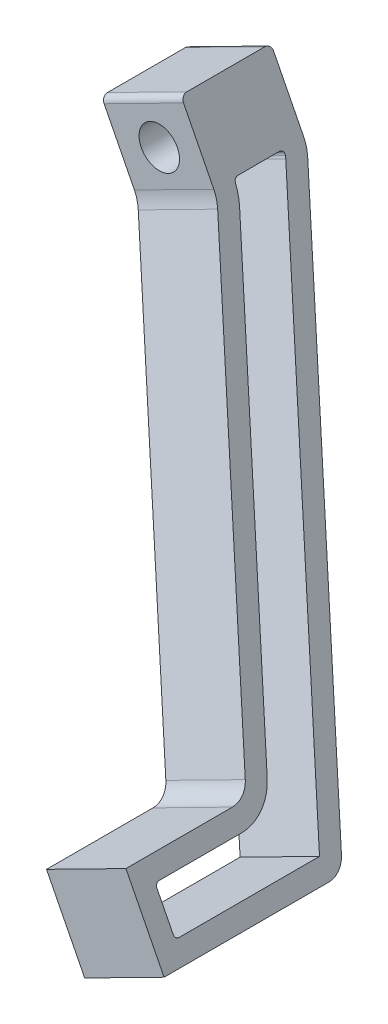
ISO-10303-21;
HEADER;
FILE_DESCRIPTION(('STEP AP214'),'2;1');
FILE_NAME('part.step','',(''),(''),'','','');
FILE_SCHEMA(('AUTOMOTIVE_DESIGN { 1 0 10303 214 1 1 1 1 }'));
ENDSEC;
DATA;
#1=APPLICATION_CONTEXT('core data for automotive mechanical design processes');
#2=APPLICATION_PROTOCOL_DEFINITION('international standard','automotive_design',2000,#1);
#3=PRODUCT_CONTEXT('',#1,'mechanical');
#4=PRODUCT('Part','Part','',(#3));
#5=PRODUCT_RELATED_PRODUCT_CATEGORY('part','',(#4));
#6=PRODUCT_DEFINITION_FORMATION('','',#4);
#7=PRODUCT_DEFINITION_CONTEXT('part definition',#1,'design');
#8=PRODUCT_DEFINITION('design','',#6,#7);
#9=PRODUCT_DEFINITION_SHAPE('','',#8);
#10=(LENGTH_UNIT() NAMED_UNIT(*) SI_UNIT(.MILLI.,.METRE.));
#11=(NAMED_UNIT(*) PLANE_ANGLE_UNIT() SI_UNIT($,.RADIAN.));
#12=(NAMED_UNIT(*) SI_UNIT($,.STERADIAN.) SOLID_ANGLE_UNIT());
#13=UNCERTAINTY_MEASURE_WITH_UNIT(LENGTH_MEASURE(1.E-05),#10,'distance_accuracy_value','');
#14=(GEOMETRIC_REPRESENTATION_CONTEXT(3) GLOBAL_UNCERTAINTY_ASSIGNED_CONTEXT((#13)) GLOBAL_UNIT_ASSIGNED_CONTEXT((#10,
#11,#12)) REPRESENTATION_CONTEXT('',''));
#15=CARTESIAN_POINT('',(0.,0.,0.));
#16=DIRECTION('',(0.,0.,1.));
#17=DIRECTION('',(1.,0.,0.));
#18=AXIS2_PLACEMENT_3D('',#15,#16,#17);
#19=CARTESIAN_POINT('',(632.18446511918,859.888360362767,1293.58737937312));
#20=DIRECTION('',(0.453212777096288,-0.89140236631763,0.));
#21=DIRECTION('',(0.89140236631763,0.453212777096288,0.));
#22=AXIS2_PLACEMENT_3D('',#19,#20,#21);
#23=PLANE('',#22);
#24=DIRECTION('',(0.,0.,1.));
#25=VECTOR('',#24,1.);
#26=CARTESIAN_POINT('',(632.18446511918,859.888360362767,1293.58737937312));
#27=LINE('',#26,#25);
#28=CARTESIAN_POINT('',(632.18446511918,859.888360362767,1267.03572984114));
#29=VERTEX_POINT('',#28);
#30=CARTESIAN_POINT('',(632.18446511918,859.888360362767,1293.58737937312));
#31=VERTEX_POINT('',#30);
#32=EDGE_CURVE('E261',#29,#31,#27,.T.);
#33=ORIENTED_EDGE('',*,*,#32,.F.);
#34=DIRECTION('',(-0.89140236631763,-0.453212777096288,0.));
#35=VECTOR('',#34,1.);
#36=CARTESIAN_POINT('',(612.37304752777,849.815706391802,1267.03572984114));
#37=LINE('',#36,#35);
#38=CARTESIAN_POINT('',(612.37304752777,849.815706391802,1267.03572984114));
#39=VERTEX_POINT('',#38);
#40=EDGE_CURVE('E337',#29,#39,#37,.T.);
#41=ORIENTED_EDGE('',*,*,#40,.T.);
#42=DIRECTION('',(0.,0.,1.));
#43=VECTOR('',#42,1.);
#44=CARTESIAN_POINT('',(612.37304752777,849.815706391802,1293.58737937312));
#45=LINE('',#44,#43);
#46=CARTESIAN_POINT('',(612.37304752777,849.815706391802,1293.58737937312));
#47=VERTEX_POINT('',#46);
#48=EDGE_CURVE('E260',#39,#47,#45,.T.);
#49=ORIENTED_EDGE('',*,*,#48,.T.);
#50=DIRECTION('',(-0.89140236631763,-0.453212777096288,0.));
#51=VECTOR('',#50,1.);
#52=CARTESIAN_POINT('',(632.18446511918,859.888360362767,1293.58737937312));
#53=LINE('',#52,#51);
#54=EDGE_CURVE('E303',#31,#47,#53,.T.);
#55=ORIENTED_EDGE('',*,*,#54,.F.);
#56=EDGE_LOOP('',(#33,#41,#49,#55));
#57=FACE_BOUND('',#56,.T.);
#58=ADVANCED_FACE('F43',(#57),#23,.F.);
#59=CARTESIAN_POINT('',(641.701933438202,841.168910670097,1293.58737937312));
#60=DIRECTION('',(0.,0.,-1.));
#61=DIRECTION('',(-1.,0.,0.));
#62=AXIS2_PLACEMENT_3D('',#59,#60,#61);
#63=PLANE('',#62);
#64=DIRECTION('',(0.453212777096286,-0.891402366317631,0.));
#65=VECTOR('',#64,1.);
#66=CARTESIAN_POINT('',(621.890515846792,831.096256699132,1293.58737937312));
#67=LINE('',#66,#65);
#68=CARTESIAN_POINT('',(621.890515846792,831.096256699132,1293.58737937312));
#69=VERTEX_POINT('',#68);
#70=EDGE_CURVE('E284',#47,#69,#67,.T.);
#71=ORIENTED_EDGE('',*,*,#70,.T.);
#72=DIRECTION('',(-0.89140236631763,-0.453212777096288,0.));
#73=VECTOR('',#72,1.);
#74=CARTESIAN_POINT('',(641.701933438202,841.168910670097,1293.58737937312));
#75=LINE('',#74,#73);
#76=CARTESIAN_POINT('',(641.701933438202,841.168910670097,1293.58737937312));
#77=VERTEX_POINT('',#76);
#78=EDGE_CURVE('E282',#77,#69,#75,.T.);
#79=ORIENTED_EDGE('',*,*,#78,.F.);
#80=DIRECTION('',(0.453212777096286,-0.891402366317631,0.));
#81=VECTOR('',#80,1.);
#82=CARTESIAN_POINT('',(641.701933438202,841.168910670097,1293.58737937312));
#83=LINE('',#82,#81);
#84=EDGE_CURVE('E263',#31,#77,#83,.T.);
#85=ORIENTED_EDGE('',*,*,#84,.F.);
#86=ORIENTED_EDGE('',*,*,#54,.T.);
#87=EDGE_LOOP('',(#71,#79,#85,#86));
#88=FACE_BOUND('',#87,.T.);
#89=ADVANCED_FACE('F414',(#88),#63,.F.);
#90=CARTESIAN_POINT('',(641.701933438202,841.168910670097,1293.58737937312));
#91=DIRECTION('',(-0.453212777096288,0.89140236631763,0.));
#92=DIRECTION('',(-0.89140236631763,-0.453212777096288,0.));
#93=AXIS2_PLACEMENT_3D('',#90,#91,#92);
#94=PLANE('',#93);
#95=DIRECTION('',(0.,0.,-1.));
#96=VECTOR('',#95,1.);
#97=CARTESIAN_POINT('',(621.890515846792,831.096256699132,1293.58737937312));
#98=LINE('',#97,#96);
#99=CARTESIAN_POINT('',(621.890515846792,831.096256699132,1252.55265787544));
#100=VERTEX_POINT('',#99);
#101=EDGE_CURVE('E286',#69,#100,#98,.T.);
#102=ORIENTED_EDGE('',*,*,#101,.T.);
#103=DIRECTION('',(-0.89140236631763,-0.453212777096288,0.));
#104=VECTOR('',#103,1.);
#105=CARTESIAN_POINT('',(641.701933438202,841.168910670097,1252.55265787544));
#106=LINE('',#105,#104);
#107=CARTESIAN_POINT('',(641.701933438202,841.168910670097,1252.55265787544));
#108=VERTEX_POINT('',#107);
#109=EDGE_CURVE('E333',#100,#108,#106,.F.);
#110=ORIENTED_EDGE('',*,*,#109,.T.);
#111=DIRECTION('',(0.,0.,-1.));
#112=VECTOR('',#111,1.);
#113=CARTESIAN_POINT('',(641.701933438202,841.168910670097,1293.58737937312));
#114=LINE('',#113,#112);
#115=EDGE_CURVE('E266',#77,#108,#114,.T.);
#116=ORIENTED_EDGE('',*,*,#115,.F.);
#117=ORIENTED_EDGE('',*,*,#78,.T.);
#118=EDGE_LOOP('',(#102,#110,#116,#117));
#119=FACE_BOUND('',#118,.T.);
#120=ADVANCED_FACE('F422',(#119),#94,.F.);
#121=CARTESIAN_POINT('',(587.243580373247,948.280420409258,1203.42531493312));
#122=DIRECTION('',(-0.161044482403292,0.316750630060443,0.934737242782039));
#123=DIRECTION('',(0.,-0.947099592759699,0.320939809612974));
#124=AXIS2_PLACEMENT_3D('',#121,#122,#123);
#125=PLANE('',#124);
#126=DIRECTION('',(-0.423634861656575,0.833226990101127,-0.355339678274509));
#127=VECTOR('',#126,1.);
#128=CARTESIAN_POINT('',(587.243580373247,948.280420409258,1203.42531493312));
#129=LINE('',#128,#127);
#130=CARTESIAN_POINT('',(640.241091964737,844.042169351383,1247.87897166153));
#131=VERTEX_POINT('',#130);
#132=CARTESIAN_POINT('',(588.021640939397,946.750090584385,1204.0779425053));
#133=VERTEX_POINT('',#132);
#134=EDGE_CURVE('E269',#131,#133,#129,.T.);
#135=ORIENTED_EDGE('',*,*,#134,.F.);
#136=DIRECTION('',(-0.89140236631763,-0.453212777096288,0.));
#137=VECTOR('',#136,1.);
#138=CARTESIAN_POINT('',(640.241091964737,844.042169351383,1247.87897166153));
#139=LINE('',#138,#137);
#140=CARTESIAN_POINT('',(620.429674373327,833.969515380418,1247.87897166153));
#141=VERTEX_POINT('',#140);
#142=EDGE_CURVE('E328',#131,#141,#139,.T.);
#143=ORIENTED_EDGE('',*,*,#142,.T.);
#144=DIRECTION('',(-0.423634861656575,0.833226990101127,-0.355339678274509));
#145=VECTOR('',#144,1.);
#146=CARTESIAN_POINT('',(567.432162781838,938.207766438293,1203.42531493312));
#147=LINE('',#146,#145);
#148=CARTESIAN_POINT('',(568.210223347987,936.67743661342,1204.0779425053));
#149=VERTEX_POINT('',#148);
#150=EDGE_CURVE('E289',#141,#149,#147,.T.);
#151=ORIENTED_EDGE('',*,*,#150,.T.);
#152=DIRECTION('',(-0.89140236631763,-0.453212777096288,0.));
#153=VECTOR('',#152,1.);
#154=CARTESIAN_POINT('',(588.021640939397,946.750090584385,1204.0779425053));
#155=LINE('',#154,#153);
#156=EDGE_CURVE('E318',#149,#133,#155,.F.);
#157=ORIENTED_EDGE('',*,*,#156,.T.);
#158=EDGE_LOOP('',(#135,#143,#151,#157));
#159=FACE_BOUND('',#158,.T.);
#160=ADVANCED_FACE('F557',(#159),#125,.F.);
#161=CARTESIAN_POINT('',(578.179324831322,966.10846773561,1203.42531493312));
#162=DIRECTION('',(0.,0.,1.));
#163=DIRECTION('',(1.,0.,0.));
#164=AXIS2_PLACEMENT_3D('',#161,#162,#163);
#165=PLANE('',#164);
#166=CARTESIAN_POINT('',(572.80574380658,952.158117086952,1203.42531493312));
#167=DIRECTION('',(0.,0.,-1.));
#168=DIRECTION('',(-1.,0.,0.));
#169=AXIS2_PLACEMENT_3D('',#166,#167,#168);
#170=CIRCLE('',#169,5.04190000000004);
#171=CARTESIAN_POINT('',(567.76384380658,952.158117086952,1203.42531493312));
#172=VERTEX_POINT('',#171);
#173=EDGE_CURVE('E253',#172,#172,#170,.T.);
#174=ORIENTED_EDGE('',*,*,#173,.F.);
#175=EDGE_LOOP('',(#174));
#176=FACE_BOUND('',#175,.T.);
#177=DIRECTION('',(-0.45321277709629,0.891402366317629,0.));
#178=VECTOR('',#177,1.);
#179=CARTESIAN_POINT('',(558.367907239912,956.035813764645,1203.42531493312));
#180=LINE('',#179,#178);
#181=CARTESIAN_POINT('',(566.599778523954,939.844942914024,1203.42531493312));
#182=VERTEX_POINT('',#181);
#183=CARTESIAN_POINT('',(559.047726405557,954.698710215169,1203.42531493312));
#184=VERTEX_POINT('',#183);
#185=EDGE_CURVE('E291',#182,#184,#180,.T.);
#186=ORIENTED_EDGE('',*,*,#185,.T.);
#187=DIRECTION('',(-0.89140236631763,-0.453212777096288,0.));
#188=VECTOR('',#187,1.);
#189=CARTESIAN_POINT('',(578.859143996966,964.771364186134,1203.42531493312));
#190=LINE('',#189,#188);
#191=CARTESIAN_POINT('',(578.859143996966,964.771364186134,1203.42531493312));
#192=VERTEX_POINT('',#191);
#193=EDGE_CURVE('E355',#184,#192,#190,.F.);
#194=ORIENTED_EDGE('',*,*,#193,.T.);
#195=DIRECTION('',(-0.45321277709629,0.891402366317629,0.));
#196=VECTOR('',#195,1.);
#197=CARTESIAN_POINT('',(578.179324831322,966.10846773561,1203.42531493312));
#198=LINE('',#197,#196);
#199=CARTESIAN_POINT('',(586.411196115364,949.917596884989,1203.42531493312));
#200=VERTEX_POINT('',#199);
#201=EDGE_CURVE('E271',#200,#192,#198,.T.);
#202=ORIENTED_EDGE('',*,*,#201,.F.);
#203=DIRECTION('',(-0.89140236631763,-0.453212777096288,0.));
#204=VECTOR('',#203,1.);
#205=CARTESIAN_POINT('',(586.411196115364,949.917596884989,1203.42531493312));
#206=LINE('',#205,#204);
#207=EDGE_CURVE('E312',#200,#182,#206,.T.);
#208=ORIENTED_EDGE('',*,*,#207,.T.);
#209=EDGE_LOOP('',(#186,#194,#202,#208));
#210=FACE_BOUND('',#209,.T.);
#211=ADVANCED_FACE('F553',(#176,#210),#165,.F.);
#212=CARTESIAN_POINT('',(578.179324831322,966.10846773561,1203.42531493312));
#213=DIRECTION('',(0.453212777096288,-0.89140236631763,0.));
#214=DIRECTION('',(0.89140236631763,0.453212777096288,0.));
#215=AXIS2_PLACEMENT_3D('',#212,#213,#214);
#216=PLANE('',#215);
#217=DIRECTION('',(0.,0.,1.));
#218=VECTOR('',#217,1.);
#219=CARTESIAN_POINT('',(578.179324831322,966.10846773561,1203.42531493312));
#220=LINE('',#219,#218);
#221=CARTESIAN_POINT('',(578.179324831322,966.10846773561,1204.92531493312));
#222=VERTEX_POINT('',#221);
#223=CARTESIAN_POINT('',(578.179324831322,966.108467735611,1224.39152151915));
#224=VERTEX_POINT('',#223);
#225=EDGE_CURVE('E274',#222,#224,#220,.T.);
#226=ORIENTED_EDGE('',*,*,#225,.F.);
#227=DIRECTION('',(-0.89140236631763,-0.453212777096288,0.));
#228=VECTOR('',#227,1.);
#229=CARTESIAN_POINT('',(578.179324831322,966.10846773561,1204.92531493312));
#230=LINE('',#229,#228);
#231=CARTESIAN_POINT('',(558.367907239912,956.035813764645,1204.92531493312));
#232=VERTEX_POINT('',#231);
#233=EDGE_CURVE('E348',#222,#232,#230,.T.);
#234=ORIENTED_EDGE('',*,*,#233,.T.);
#235=DIRECTION('',(0.,0.,1.));
#236=VECTOR('',#235,1.);
#237=CARTESIAN_POINT('',(558.367907239912,956.035813764645,1203.42531493312));
#238=LINE('',#237,#236);
#239=CARTESIAN_POINT('',(558.367907239912,956.035813764646,1224.39152151915));
#240=VERTEX_POINT('',#239);
#241=EDGE_CURVE('E294',#232,#240,#238,.T.);
#242=ORIENTED_EDGE('',*,*,#241,.T.);
#243=DIRECTION('',(-0.89140236631763,-0.453212777096288,0.));
#244=VECTOR('',#243,1.);
#245=CARTESIAN_POINT('',(578.179324831321,966.108467735611,1224.39152151915));
#246=LINE('',#245,#244);
#247=EDGE_CURVE('E346',#240,#224,#246,.F.);
#248=ORIENTED_EDGE('',*,*,#247,.T.);
#249=EDGE_LOOP('',(#226,#234,#242,#248));
#250=FACE_BOUND('',#249,.T.);
#251=ADVANCED_FACE('F549',(#250),#216,.F.);
#252=CARTESIAN_POINT('',(578.179324831322,966.108467735611,1225.89152151915));
#253=DIRECTION('',(0.,0.,-1.));
#254=DIRECTION('',(-1.,0.,0.));
#255=AXIS2_PLACEMENT_3D('',#252,#253,#254);
#256=PLANE('',#255);
#257=CARTESIAN_POINT('',(572.80574380658,952.158117086952,1225.89152151915));
#258=DIRECTION('',(0.,0.,-1.));
#259=DIRECTION('',(-1.,0.,0.));
#260=AXIS2_PLACEMENT_3D('',#257,#258,#259);
#261=CIRCLE('',#260,5.04189999999999);
#262=CARTESIAN_POINT('',(567.76384380658,952.158117086952,1225.89152151915));
#263=VERTEX_POINT('',#262);
#264=EDGE_CURVE('E257',#263,#263,#261,.T.);
#265=ORIENTED_EDGE('',*,*,#264,.T.);
#266=EDGE_LOOP('',(#265));
#267=FACE_BOUND('',#266,.T.);
#268=DIRECTION('',(0.453212777096286,-0.891402366317631,0.));
#269=VECTOR('',#268,1.);
#270=CARTESIAN_POINT('',(578.179324831322,966.108467735611,1225.89152151915));
#271=LINE('',#270,#269);
#272=CARTESIAN_POINT('',(578.859143996966,964.771364186134,1225.89152151915));
#273=VERTEX_POINT('',#272);
#274=CARTESIAN_POINT('',(586.411196115364,949.917596884989,1225.89152151915));
#275=VERTEX_POINT('',#274);
#276=EDGE_CURVE('E277',#273,#275,#271,.T.);
#277=ORIENTED_EDGE('',*,*,#276,.F.);
#278=DIRECTION('',(-0.89140236631763,-0.453212777096288,0.));
#279=VECTOR('',#278,1.);
#280=CARTESIAN_POINT('',(578.859143996966,964.771364186134,1225.89152151915));
#281=LINE('',#280,#279);
#282=CARTESIAN_POINT('',(559.047726405557,954.698710215169,1225.89152151915));
#283=VERTEX_POINT('',#282);
#284=EDGE_CURVE('E361',#273,#283,#281,.T.);
#285=ORIENTED_EDGE('',*,*,#284,.T.);
#286=DIRECTION('',(0.453212777096286,-0.891402366317631,0.));
#287=VECTOR('',#286,1.);
#288=CARTESIAN_POINT('',(558.367907239912,956.035813764646,1225.89152151915));
#289=LINE('',#288,#287);
#290=CARTESIAN_POINT('',(566.599778523954,939.844942914024,1225.89152151915));
#291=VERTEX_POINT('',#290);
#292=EDGE_CURVE('E297',#283,#291,#289,.T.);
#293=ORIENTED_EDGE('',*,*,#292,.T.);
#294=DIRECTION('',(-0.89140236631763,-0.453212777096288,0.));
#295=VECTOR('',#294,1.);
#296=CARTESIAN_POINT('',(586.411196115364,949.917596884989,1225.89152151915));
#297=LINE('',#296,#295);
#298=EDGE_CURVE('E309',#291,#275,#297,.F.);
#299=ORIENTED_EDGE('',*,*,#298,.T.);
#300=EDGE_LOOP('',(#277,#285,#293,#299));
#301=FACE_BOUND('',#300,.T.);
#302=ADVANCED_FACE('F545',(#267,#301),#256,.F.);
#303=CARTESIAN_POINT('',(587.243580373247,948.280420409258,1225.89152151915));
#304=DIRECTION('',(0.161044482403292,-0.316750630060442,-0.934737242782039));
#305=DIRECTION('',(0.,0.9470995927597,-0.320939809612973));
#306=AXIS2_PLACEMENT_3D('',#303,#304,#305);
#307=PLANE('',#306);
#308=DIRECTION('',(0.423634861656575,-0.833226990101127,0.355339678274508));
#309=VECTOR('',#308,1.);
#310=CARTESIAN_POINT('',(567.432162781838,938.207766438293,1225.89152151915));
#311=LINE('',#310,#309);
#312=CARTESIAN_POINT('',(568.210223347987,936.67743661342,1226.54414909133));
#313=VERTEX_POINT('',#312);
#314=CARTESIAN_POINT('',(610.912206054305,852.688965073088,1262.36204362723));
#315=VERTEX_POINT('',#314);
#316=EDGE_CURVE('E264',#313,#315,#311,.T.);
#317=ORIENTED_EDGE('',*,*,#316,.T.);
#318=DIRECTION('',(-0.89140236631763,-0.453212777096288,0.));
#319=VECTOR('',#318,1.);
#320=CARTESIAN_POINT('',(630.723623645715,862.761619044053,1262.36204362723));
#321=LINE('',#320,#319);
#322=CARTESIAN_POINT('',(630.723623645714,862.761619044053,1262.36204362723));
#323=VERTEX_POINT('',#322);
#324=EDGE_CURVE('E340',#315,#323,#321,.F.);
#325=ORIENTED_EDGE('',*,*,#324,.T.);
#326=DIRECTION('',(0.423634861656575,-0.833226990101127,0.355339678274508));
#327=VECTOR('',#326,1.);
#328=CARTESIAN_POINT('',(587.243580373247,948.280420409258,1225.89152151915));
#329=LINE('',#328,#327);
#330=CARTESIAN_POINT('',(588.021640939397,946.750090584385,1226.54414909133));
#331=VERTEX_POINT('',#330);
#332=EDGE_CURVE('E279',#331,#323,#329,.T.);
#333=ORIENTED_EDGE('',*,*,#332,.F.);
#334=DIRECTION('',(-0.89140236631763,-0.453212777096288,0.));
#335=VECTOR('',#334,1.);
#336=CARTESIAN_POINT('',(568.210223347987,936.67743661342,1226.54414909133));
#337=LINE('',#336,#335);
#338=EDGE_CURVE('E306',#331,#313,#337,.T.);
#339=ORIENTED_EDGE('',*,*,#338,.T.);
#340=EDGE_LOOP('',(#317,#325,#333,#339));
#341=FACE_BOUND('',#340,.T.);
#342=ADVANCED_FACE('F541',(#341),#307,.F.);
#343=CARTESIAN_POINT('',(849.723172798776,432.021961640134,0.));
#344=DIRECTION('',(-0.891402366317631,-0.453212777096286,0.));
#345=DIRECTION('',(0.453212777096286,-0.891402366317631,0.));
#346=AXIS2_PLACEMENT_3D('',#343,#344,#345);
#347=PLANE('',#346);
#348=DIRECTION('',(0.,0.,1.));
#349=VECTOR('',#348,1.);
#350=CARTESIAN_POINT('',(586.41119611536,949.917596884987,1220.89152151915));
#351=LINE('',#350,#349);
#352=CARTESIAN_POINT('',(586.41119611536,949.917596884987,1209.55233158691));
#353=VERTEX_POINT('',#352);
#354=CARTESIAN_POINT('',(586.41119611536,949.917596884987,1219.92280209648));
#355=VERTEX_POINT('',#354);
#356=EDGE_CURVE('E399',#353,#355,#351,.T.);
#357=ORIENTED_EDGE('',*,*,#356,.F.);
#358=CARTESIAN_POINT('',(586.86440889246,949.026194518672,1209.55233158691));
#359=DIRECTION('',(-0.891402366317631,-0.453212777096286,0.));
#360=DIRECTION('',(0.453212777096286,-0.891402366317631,0.));
#361=AXIS2_PLACEMENT_3D('',#358,#359,#360);
#362=CIRCLE('',#361,1.);
#363=CARTESIAN_POINT('',(586.97771208673,948.80334392709,1208.58408575036));
#364=VERTEX_POINT('',#363);
#365=EDGE_CURVE('E391',#353,#364,#362,.T.);
#366=ORIENTED_EDGE('',*,*,#365,.T.);
#367=CARTESIAN_POINT('',(586.41119611536,949.917596884987,1213.42531493312));
#368=DIRECTION('',(0.891402366317629,0.45321277709629,0.));
#369=DIRECTION('',(-0.45321277709629,0.891402366317629,0.));
#370=AXIS2_PLACEMENT_3D('',#367,#368,#369);
#371=CIRCLE('',#370,4.99999999999999);
#372=CARTESIAN_POINT('',(587.216418527376,948.333843734685,1208.75162871921));
#373=VERTEX_POINT('',#372);
#374=EDGE_CURVE('E404',#373,#364,#371,.T.);
#375=ORIENTED_EDGE('',*,*,#374,.F.);
#376=DIRECTION('',(-0.423634861656577,0.833226990101125,-0.355339678274509));
#377=VECTOR('',#376,1.);
#378=CARTESIAN_POINT('',(639.435869552716,845.625922501683,1252.55265787544));
#379=LINE('',#378,#377);
#380=CARTESIAN_POINT('',(639.435869552716,845.625922501683,1252.55265787544));
#381=VERTEX_POINT('',#380);
#382=EDGE_CURVE('E242',#381,#373,#379,.T.);
#383=ORIENTED_EDGE('',*,*,#382,.F.);
#384=DIRECTION('',(0.,0.,-1.));
#385=VECTOR('',#384,1.);
#386=CARTESIAN_POINT('',(639.435869552716,845.625922501683,1288.58737937312));
#387=LINE('',#386,#385);
#388=CARTESIAN_POINT('',(639.435869552716,845.625922501683,1287.58737937312));
#389=VERTEX_POINT('',#388);
#390=EDGE_CURVE('E247',#389,#381,#387,.T.);
#391=ORIENTED_EDGE('',*,*,#390,.F.);
#392=CARTESIAN_POINT('',(638.982656775624,846.517324868003,1287.58737937312));
#393=DIRECTION('',(-0.891402366317631,-0.453212777096286,0.));
#394=DIRECTION('',(0.453212777096286,-0.891402366317631,0.));
#395=AXIS2_PLACEMENT_3D('',#392,#393,#394);
#396=CIRCLE('',#395,1.);
#397=CARTESIAN_POINT('',(638.98265677562,846.517324868001,1288.58737937312));
#398=VERTEX_POINT('',#397);
#399=EDGE_CURVE('E383',#389,#398,#396,.T.);
#400=ORIENTED_EDGE('',*,*,#399,.T.);
#401=DIRECTION('',(0.453212777096286,-0.891402366317631,0.));
#402=VECTOR('',#401,1.);
#403=CARTESIAN_POINT('',(634.450529004657,855.431348531177,1288.58737937312));
#404=LINE('',#403,#402);
#405=CARTESIAN_POINT('',(634.903741781753,854.539946164859,1288.58737937312));
#406=VERTEX_POINT('',#405);
#407=EDGE_CURVE('E497',#406,#398,#404,.T.);
#408=ORIENTED_EDGE('',*,*,#407,.F.);
#409=CARTESIAN_POINT('',(634.903741781757,854.539946164861,1287.58737937312));
#410=DIRECTION('',(-0.891402366317631,-0.453212777096286,0.));
#411=DIRECTION('',(0.453212777096286,-0.891402366317631,0.));
#412=AXIS2_PLACEMENT_3D('',#409,#410,#411);
#413=CIRCLE('',#412,1.);
#414=CARTESIAN_POINT('',(634.450529004657,855.431348531177,1287.58737937312));
#415=VERTEX_POINT('',#414);
#416=EDGE_CURVE('E387',#406,#415,#413,.T.);
#417=ORIENTED_EDGE('',*,*,#416,.T.);
#418=DIRECTION('',(0.,0.,1.));
#419=VECTOR('',#418,1.);
#420=CARTESIAN_POINT('',(634.450529004657,855.431348531177,1267.03572984114));
#421=LINE('',#420,#419);
#422=CARTESIAN_POINT('',(634.450529004657,855.431348531177,1267.03572984114));
#423=VERTEX_POINT('',#422);
#424=EDGE_CURVE('E494',#423,#415,#421,.T.);
#425=ORIENTED_EDGE('',*,*,#424,.F.);
#426=CARTESIAN_POINT('',(629.918401233694,864.345372194353,1267.03572984114));
#427=DIRECTION('',(-0.891402366317629,-0.45321277709629,0.));
#428=DIRECTION('',(-0.45321277709629,0.891402366317629,0.));
#429=AXIS2_PLACEMENT_3D('',#426,#427,#428);
#430=CIRCLE('',#429,10.0000000000001);
#431=CARTESIAN_POINT('',(631.528846057727,861.177865893749,1257.68835741332));
#432=VERTEX_POINT('',#431);
#433=EDGE_CURVE('E491',#432,#423,#430,.T.);
#434=ORIENTED_EDGE('',*,*,#433,.F.);
#435=DIRECTION('',(0.423634861656577,-0.833226990101126,0.355339678274508));
#436=VECTOR('',#435,1.);
#437=CARTESIAN_POINT('',(588.826863351409,945.166337434081,1221.87046287742));
#438=LINE('',#437,#436);
#439=CARTESIAN_POINT('',(588.826863351409,945.166337434081,1221.87046287742));
#440=VERTEX_POINT('',#439);
#441=EDGE_CURVE('E489',#440,#432,#438,.T.);
#442=ORIENTED_EDGE('',*,*,#441,.F.);
#443=CARTESIAN_POINT('',(586.41119611536,949.917596884987,1235.89152151915));
#444=DIRECTION('',(-0.891402366317629,-0.45321277709629,0.));
#445=DIRECTION('',(-0.45321277709629,0.891402366317629,0.));
#446=AXIS2_PLACEMENT_3D('',#443,#444,#445);
#447=CIRCLE('',#446,15.);
#448=CARTESIAN_POINT('',(586.836083093888,949.081907166565,1220.9208470604));
#449=VERTEX_POINT('',#448);
#450=EDGE_CURVE('E241',#449,#440,#447,.T.);
#451=ORIENTED_EDGE('',*,*,#450,.F.);
#452=CARTESIAN_POINT('',(586.86440889246,949.026194518672,1219.92280209648));
#453=DIRECTION('',(-0.891402366317631,-0.453212777096286,0.));
#454=DIRECTION('',(0.453212777096286,-0.891402366317631,0.));
#455=AXIS2_PLACEMENT_3D('',#452,#453,#454);
#456=CIRCLE('',#455,1.);
#457=EDGE_CURVE('E51',#449,#355,#456,.T.);
#458=ORIENTED_EDGE('',*,*,#457,.T.);
#459=EDGE_LOOP('',(#357,#366,#375,#383,#391,#400,#408,#417,#425,#434,#442,#451,#458));
#460=FACE_BOUND('',#459,.T.);
#461=ORIENTED_EDGE('',*,*,#201,.T.);
#462=CARTESIAN_POINT('',(578.859143996966,964.771364186134,1204.92531493312));
#463=DIRECTION('',(-0.891402366317631,-0.453212777096286,0.));
#464=DIRECTION('',(0.453212777096286,-0.891402366317631,0.));
#465=AXIS2_PLACEMENT_3D('',#462,#463,#464);
#466=CIRCLE('',#465,1.5);
#467=EDGE_CURVE('E359',#192,#222,#466,.F.);
#468=ORIENTED_EDGE('',*,*,#467,.T.);
#469=ORIENTED_EDGE('',*,*,#225,.T.);
#470=CARTESIAN_POINT('',(578.859143996966,964.771364186134,1224.39152151915));
#471=DIRECTION('',(-0.891402366317631,-0.453212777096286,0.));
#472=DIRECTION('',(0.453212777096286,-0.891402366317631,0.));
#473=AXIS2_PLACEMENT_3D('',#470,#471,#472);
#474=CIRCLE('',#473,1.5);
#475=EDGE_CURVE('E357',#224,#273,#474,.F.);
#476=ORIENTED_EDGE('',*,*,#475,.T.);
#477=ORIENTED_EDGE('',*,*,#276,.T.);
#478=CARTESIAN_POINT('',(586.411196115364,949.917596884989,1235.89152151915));
#479=DIRECTION('',(-0.891402366317631,-0.453212777096286,0.));
#480=DIRECTION('',(0.453212777096286,-0.891402366317631,0.));
#481=AXIS2_PLACEMENT_3D('',#478,#479,#480);
#482=CIRCLE('',#481,10.);
#483=EDGE_CURVE('E326',#275,#331,#482,.T.);
#484=ORIENTED_EDGE('',*,*,#483,.T.);
#485=ORIENTED_EDGE('',*,*,#332,.T.);
#486=CARTESIAN_POINT('',(629.918401233698,864.345372194355,1267.03572984114));
#487=DIRECTION('',(-0.891402366317631,-0.453212777096286,0.));
#488=DIRECTION('',(0.453212777096286,-0.891402366317631,0.));
#489=AXIS2_PLACEMENT_3D('',#486,#487,#488);
#490=CIRCLE('',#489,5.);
#491=EDGE_CURVE('E344',#323,#29,#490,.T.);
#492=ORIENTED_EDGE('',*,*,#491,.T.);
#493=ORIENTED_EDGE('',*,*,#32,.T.);
#494=ORIENTED_EDGE('',*,*,#84,.T.);
#495=ORIENTED_EDGE('',*,*,#115,.T.);
#496=CARTESIAN_POINT('',(639.43586955272,845.625922501685,1252.55265787544));
#497=DIRECTION('',(-0.891402366317631,-0.453212777096286,0.));
#498=DIRECTION('',(0.453212777096286,-0.891402366317631,0.));
#499=AXIS2_PLACEMENT_3D('',#496,#497,#498);
#500=CIRCLE('',#499,5.);
#501=EDGE_CURVE('E335',#108,#131,#500,.F.);
#502=ORIENTED_EDGE('',*,*,#501,.T.);
#503=ORIENTED_EDGE('',*,*,#134,.T.);
#504=CARTESIAN_POINT('',(586.411196115364,949.917596884989,1213.42531493312));
#505=DIRECTION('',(-0.891402366317631,-0.453212777096286,0.));
#506=DIRECTION('',(0.453212777096286,-0.891402366317631,0.));
#507=AXIS2_PLACEMENT_3D('',#504,#505,#506);
#508=CIRCLE('',#507,10.);
#509=EDGE_CURVE('E321',#133,#200,#508,.F.);
#510=ORIENTED_EDGE('',*,*,#509,.T.);
#511=EDGE_LOOP('',(#461,#468,#469,#476,#477,#484,#485,#492,#493,#494,#495,#502,#503,#510));
#512=FACE_BOUND('',#511,.T.);
#513=ADVANCED_FACE('F397',(#460,#512),#347,.F.);
#514=CARTESIAN_POINT('',(829.911755207366,421.949307669169,0.));
#515=DIRECTION('',(-0.891402366317631,-0.453212777096286,0.));
#516=DIRECTION('',(0.453212777096286,-0.891402366317631,0.));
#517=AXIS2_PLACEMENT_3D('',#514,#515,#516);
#518=PLANE('',#517);
#519=CARTESIAN_POINT('',(566.599778523954,939.844942914024,1213.42531493312));
#520=DIRECTION('',(-0.891402366317631,-0.453212777096286,0.));
#521=DIRECTION('',(0.453212777096286,-0.891402366317631,0.));
#522=AXIS2_PLACEMENT_3D('',#519,#520,#521);
#523=CIRCLE('',#522,4.99999999999999);
#524=CARTESIAN_POINT('',(567.405000935971,938.261189763722,1208.75162871921));
#525=VERTEX_POINT('',#524);
#526=CARTESIAN_POINT('',(567.166294495325,938.730689956127,1208.58408575036));
#527=VERTEX_POINT('',#526);
#528=EDGE_CURVE('E484',#525,#527,#523,.F.);
#529=ORIENTED_EDGE('',*,*,#528,.T.);
#530=CARTESIAN_POINT('',(567.052991301051,938.953540547707,1209.55233158691));
#531=DIRECTION('',(-0.891402366317631,-0.453212777096286,0.));
#532=DIRECTION('',(0.453212777096286,-0.891402366317631,0.));
#533=AXIS2_PLACEMENT_3D('',#530,#531,#532);
#534=CIRCLE('',#533,1.);
#535=CARTESIAN_POINT('',(566.599778523954,939.844942914024,1209.55233158691));
#536=VERTEX_POINT('',#535);
#537=EDGE_CURVE('E393',#527,#536,#534,.F.);
#538=ORIENTED_EDGE('',*,*,#537,.T.);
#539=DIRECTION('',(0.,0.,1.));
#540=VECTOR('',#539,1.);
#541=CARTESIAN_POINT('',(566.599778523954,939.844942914024,1220.89152151915));
#542=LINE('',#541,#540);
#543=CARTESIAN_POINT('',(566.599778523954,939.844942914024,1219.92280209648));
#544=VERTEX_POINT('',#543);
#545=EDGE_CURVE('E251',#536,#544,#542,.T.);
#546=ORIENTED_EDGE('',*,*,#545,.T.);
#547=CARTESIAN_POINT('',(567.052991301051,938.953540547707,1219.92280209648));
#548=DIRECTION('',(-0.891402366317631,-0.453212777096286,0.));
#549=DIRECTION('',(0.453212777096286,-0.891402366317631,0.));
#550=AXIS2_PLACEMENT_3D('',#547,#548,#549);
#551=CIRCLE('',#550,1.);
#552=CARTESIAN_POINT('',(567.024665502482,939.009253195601,1220.9208470604));
#553=VERTEX_POINT('',#552);
#554=EDGE_CURVE('E11',#544,#553,#551,.F.);
#555=ORIENTED_EDGE('',*,*,#554,.T.);
#556=CARTESIAN_POINT('',(566.599778523954,939.844942914024,1235.89152151915));
#557=DIRECTION('',(-0.891402366317631,-0.453212777096286,0.));
#558=DIRECTION('',(0.453212777096286,-0.891402366317631,0.));
#559=AXIS2_PLACEMENT_3D('',#556,#557,#558);
#560=CIRCLE('',#559,15.);
#561=CARTESIAN_POINT('',(569.015445760004,935.093683463118,1221.87046287742));
#562=VERTEX_POINT('',#561);
#563=EDGE_CURVE('E219',#553,#562,#560,.T.);
#564=ORIENTED_EDGE('',*,*,#563,.T.);
#565=DIRECTION('',(0.423634861656573,-0.833226990101128,0.355339678274508));
#566=VECTOR('',#565,1.);
#567=CARTESIAN_POINT('',(569.015445760004,935.093683463117,1221.87046287742));
#568=LINE('',#567,#566);
#569=CARTESIAN_POINT('',(611.717428466322,851.105211922786,1257.68835741332));
#570=VERTEX_POINT('',#569);
#571=EDGE_CURVE('E225',#562,#570,#568,.T.);
#572=ORIENTED_EDGE('',*,*,#571,.T.);
#573=CARTESIAN_POINT('',(610.106983642289,854.27271822339,1267.03572984114));
#574=DIRECTION('',(-0.891402366317631,-0.453212777096286,0.));
#575=DIRECTION('',(0.453212777096286,-0.891402366317631,0.));
#576=AXIS2_PLACEMENT_3D('',#573,#574,#575);
#577=CIRCLE('',#576,10.0000000000001);
#578=CARTESIAN_POINT('',(614.639111413252,845.358694560214,1267.03572984114));
#579=VERTEX_POINT('',#578);
#580=EDGE_CURVE('E237',#570,#579,#577,.T.);
#581=ORIENTED_EDGE('',*,*,#580,.T.);
#582=DIRECTION('',(0.,0.,1.));
#583=VECTOR('',#582,1.);
#584=CARTESIAN_POINT('',(614.639111413252,845.358694560214,1267.03572984114));
#585=LINE('',#584,#583);
#586=CARTESIAN_POINT('',(614.639111413252,845.358694560214,1287.58737937312));
#587=VERTEX_POINT('',#586);
#588=EDGE_CURVE('E469',#579,#587,#585,.T.);
#589=ORIENTED_EDGE('',*,*,#588,.T.);
#590=CARTESIAN_POINT('',(615.092324190348,844.467292193896,1287.58737937312));
#591=DIRECTION('',(-0.891402366317631,-0.453212777096286,0.));
#592=DIRECTION('',(0.453212777096286,-0.891402366317631,0.));
#593=AXIS2_PLACEMENT_3D('',#590,#591,#592);
#594=CIRCLE('',#593,1.);
#595=CARTESIAN_POINT('',(615.092324190348,844.467292193896,1288.58737937312));
#596=VERTEX_POINT('',#595);
#597=EDGE_CURVE('E389',#587,#596,#594,.F.);
#598=ORIENTED_EDGE('',*,*,#597,.T.);
#599=DIRECTION('',(0.453212777096286,-0.891402366317631,0.));
#600=VECTOR('',#599,1.);
#601=CARTESIAN_POINT('',(614.639111413252,845.358694560214,1288.58737937312));
#602=LINE('',#601,#600);
#603=CARTESIAN_POINT('',(619.171239184214,836.444670897038,1288.58737937312));
#604=VERTEX_POINT('',#603);
#605=EDGE_CURVE('E467',#596,#604,#602,.T.);
#606=ORIENTED_EDGE('',*,*,#605,.T.);
#607=CARTESIAN_POINT('',(619.171239184214,836.444670897038,1287.58737937312));
#608=DIRECTION('',(-0.891402366317631,-0.453212777096286,0.));
#609=DIRECTION('',(0.453212777096286,-0.891402366317631,0.));
#610=AXIS2_PLACEMENT_3D('',#607,#608,#609);
#611=CIRCLE('',#610,1.);
#612=CARTESIAN_POINT('',(619.624451961311,835.55326853072,1287.58737937312));
#613=VERTEX_POINT('',#612);
#614=EDGE_CURVE('E385',#604,#613,#611,.F.);
#615=ORIENTED_EDGE('',*,*,#614,.T.);
#616=DIRECTION('',(0.,0.,-1.));
#617=VECTOR('',#616,1.);
#618=CARTESIAN_POINT('',(619.624451961311,835.55326853072,1288.58737937312));
#619=LINE('',#618,#617);
#620=CARTESIAN_POINT('',(619.624451961311,835.55326853072,1252.55265787544));
#621=VERTEX_POINT('',#620);
#622=EDGE_CURVE('E475',#613,#621,#619,.T.);
#623=ORIENTED_EDGE('',*,*,#622,.T.);
#624=DIRECTION('',(-0.423634861656573,0.833226990101128,-0.355339678274509));
#625=VECTOR('',#624,1.);
#626=CARTESIAN_POINT('',(619.624451961311,835.55326853072,1252.55265787544));
#627=LINE('',#626,#625);
#628=EDGE_CURVE('E477',#621,#525,#627,.T.);
#629=ORIENTED_EDGE('',*,*,#628,.T.);
#630=EDGE_LOOP('',(#529,#538,#546,#555,#564,#572,#581,#589,#598,#606,#615,#623,#629));
#631=FACE_BOUND('',#630,.T.);
#632=ORIENTED_EDGE('',*,*,#241,.F.);
#633=CARTESIAN_POINT('',(559.047726405557,954.698710215169,1204.92531493312));
#634=DIRECTION('',(-0.891402366317631,-0.453212777096286,0.));
#635=DIRECTION('',(0.453212777096286,-0.891402366317631,0.));
#636=AXIS2_PLACEMENT_3D('',#633,#634,#635);
#637=CIRCLE('',#636,1.5);
#638=EDGE_CURVE('E353',#232,#184,#637,.T.);
#639=ORIENTED_EDGE('',*,*,#638,.T.);
#640=ORIENTED_EDGE('',*,*,#185,.F.);
#641=CARTESIAN_POINT('',(566.599778523954,939.844942914024,1213.42531493312));
#642=DIRECTION('',(-0.891402366317631,-0.453212777096286,0.));
#643=DIRECTION('',(0.453212777096286,-0.891402366317631,0.));
#644=AXIS2_PLACEMENT_3D('',#641,#642,#643);
#645=CIRCLE('',#644,10.);
#646=EDGE_CURVE('E315',#182,#149,#645,.T.);
#647=ORIENTED_EDGE('',*,*,#646,.T.);
#648=ORIENTED_EDGE('',*,*,#150,.F.);
#649=CARTESIAN_POINT('',(619.624451961311,835.55326853072,1252.55265787544));
#650=DIRECTION('',(-0.891402366317631,-0.453212777096286,0.));
#651=DIRECTION('',(0.453212777096286,-0.891402366317631,0.));
#652=AXIS2_PLACEMENT_3D('',#649,#650,#651);
#653=CIRCLE('',#652,5.);
#654=EDGE_CURVE('E331',#141,#100,#653,.T.);
#655=ORIENTED_EDGE('',*,*,#654,.T.);
#656=ORIENTED_EDGE('',*,*,#101,.F.);
#657=ORIENTED_EDGE('',*,*,#70,.F.);
#658=ORIENTED_EDGE('',*,*,#48,.F.);
#659=CARTESIAN_POINT('',(610.106983642289,854.27271822339,1267.03572984114));
#660=DIRECTION('',(-0.891402366317631,-0.453212777096286,0.));
#661=DIRECTION('',(0.453212777096286,-0.891402366317631,0.));
#662=AXIS2_PLACEMENT_3D('',#659,#660,#661);
#663=CIRCLE('',#662,5.);
#664=EDGE_CURVE('E342',#39,#315,#663,.F.);
#665=ORIENTED_EDGE('',*,*,#664,.T.);
#666=ORIENTED_EDGE('',*,*,#316,.F.);
#667=CARTESIAN_POINT('',(566.599778523954,939.844942914024,1235.89152151915));
#668=DIRECTION('',(-0.891402366317631,-0.453212777096286,0.));
#669=DIRECTION('',(0.453212777096286,-0.891402366317631,0.));
#670=AXIS2_PLACEMENT_3D('',#667,#668,#669);
#671=CIRCLE('',#670,10.);
#672=EDGE_CURVE('E323',#313,#291,#671,.F.);
#673=ORIENTED_EDGE('',*,*,#672,.T.);
#674=ORIENTED_EDGE('',*,*,#292,.F.);
#675=CARTESIAN_POINT('',(559.047726405557,954.698710215169,1224.39152151915));
#676=DIRECTION('',(-0.891402366317631,-0.453212777096286,0.));
#677=DIRECTION('',(0.453212777096286,-0.891402366317631,0.));
#678=AXIS2_PLACEMENT_3D('',#675,#676,#677);
#679=CIRCLE('',#678,1.5);
#680=EDGE_CURVE('E351',#283,#240,#679,.T.);
#681=ORIENTED_EDGE('',*,*,#680,.T.);
#682=EDGE_LOOP('',(#632,#639,#640,#647,#648,#655,#656,#657,#658,#665,#666,#673,#674,#681));
#683=FACE_BOUND('',#682,.T.);
#684=ADVANCED_FACE('F222',(#631,#683),#518,.T.);
#685=CARTESIAN_POINT('',(572.80574380658,952.158117086952,1203.42531493312));
#686=DIRECTION('',(0.,0.,-1.));
#687=DIRECTION('',(-1.,0.,0.));
#688=AXIS2_PLACEMENT_3D('',#685,#686,#687);
#689=CYLINDRICAL_SURFACE('',#688,5.04189999999999);
#690=ORIENTED_EDGE('',*,*,#173,.T.);
#691=EDGE_LOOP('',(#690));
#692=FACE_BOUND('',#691,.T.);
#693=ORIENTED_EDGE('',*,*,#264,.F.);
#694=EDGE_LOOP('',(#693));
#695=FACE_BOUND('',#694,.T.);
#696=ADVANCED_FACE('F432',(#692,#695),#689,.F.);
#697=CARTESIAN_POINT('',(586.411196115364,949.917596884989,1235.89152151915));
#698=DIRECTION('',(0.89140236631763,0.453212777096288,0.));
#699=DIRECTION('',(-0.453212777096288,0.89140236631763,0.));
#700=AXIS2_PLACEMENT_3D('',#697,#698,#699);
#701=CYLINDRICAL_SURFACE('',#700,10.);
#702=ORIENTED_EDGE('',*,*,#483,.F.);
#703=ORIENTED_EDGE('',*,*,#298,.F.);
#704=ORIENTED_EDGE('',*,*,#672,.F.);
#705=ORIENTED_EDGE('',*,*,#338,.F.);
#706=EDGE_LOOP('',(#702,#703,#704,#705));
#707=FACE_BOUND('',#706,.T.);
#708=ADVANCED_FACE('F428',(#707),#701,.F.);
#709=CARTESIAN_POINT('',(586.411196115364,949.917596884989,1213.42531493312));
#710=DIRECTION('',(-0.89140236631763,-0.453212777096288,0.));
#711=DIRECTION('',(0.453212777096288,-0.89140236631763,0.));
#712=AXIS2_PLACEMENT_3D('',#709,#710,#711);
#713=CYLINDRICAL_SURFACE('',#712,10.);
#714=ORIENTED_EDGE('',*,*,#509,.F.);
#715=ORIENTED_EDGE('',*,*,#156,.F.);
#716=ORIENTED_EDGE('',*,*,#646,.F.);
#717=ORIENTED_EDGE('',*,*,#207,.F.);
#718=EDGE_LOOP('',(#714,#715,#716,#717));
#719=FACE_BOUND('',#718,.T.);
#720=ADVANCED_FACE('F431',(#719),#713,.T.);
#721=CARTESIAN_POINT('',(639.43586955272,845.625922501685,1252.55265787544));
#722=DIRECTION('',(-0.89140236631763,-0.453212777096288,0.));
#723=DIRECTION('',(0.453212777096288,-0.89140236631763,0.));
#724=AXIS2_PLACEMENT_3D('',#721,#722,#723);
#725=CYLINDRICAL_SURFACE('',#724,5.);
#726=ORIENTED_EDGE('',*,*,#501,.F.);
#727=ORIENTED_EDGE('',*,*,#109,.F.);
#728=ORIENTED_EDGE('',*,*,#654,.F.);
#729=ORIENTED_EDGE('',*,*,#142,.F.);
#730=EDGE_LOOP('',(#726,#727,#728,#729));
#731=FACE_BOUND('',#730,.T.);
#732=ADVANCED_FACE('F435',(#731),#725,.T.);
#733=CARTESIAN_POINT('',(629.918401233698,864.345372194355,1267.03572984114));
#734=DIRECTION('',(0.89140236631763,0.453212777096288,0.));
#735=DIRECTION('',(-0.453212777096288,0.89140236631763,0.));
#736=AXIS2_PLACEMENT_3D('',#733,#734,#735);
#737=CYLINDRICAL_SURFACE('',#736,5.);
#738=ORIENTED_EDGE('',*,*,#491,.F.);
#739=ORIENTED_EDGE('',*,*,#324,.F.);
#740=ORIENTED_EDGE('',*,*,#664,.F.);
#741=ORIENTED_EDGE('',*,*,#40,.F.);
#742=EDGE_LOOP('',(#738,#739,#740,#741));
#743=FACE_BOUND('',#742,.T.);
#744=ADVANCED_FACE('F439',(#743),#737,.F.);
#745=CARTESIAN_POINT('',(578.859143996966,964.771364186134,1204.92531493312));
#746=DIRECTION('',(-0.89140236631763,-0.453212777096288,0.));
#747=DIRECTION('',(0.453212777096288,-0.89140236631763,0.));
#748=AXIS2_PLACEMENT_3D('',#745,#746,#747);
#749=CYLINDRICAL_SURFACE('',#748,1.5);
#750=ORIENTED_EDGE('',*,*,#467,.F.);
#751=ORIENTED_EDGE('',*,*,#193,.F.);
#752=ORIENTED_EDGE('',*,*,#638,.F.);
#753=ORIENTED_EDGE('',*,*,#233,.F.);
#754=EDGE_LOOP('',(#750,#751,#752,#753));
#755=FACE_BOUND('',#754,.T.);
#756=ADVANCED_FACE('F443',(#755),#749,.T.);
#757=CARTESIAN_POINT('',(578.859143996966,964.771364186134,1224.39152151915));
#758=DIRECTION('',(-0.89140236631763,-0.453212777096288,0.));
#759=DIRECTION('',(0.453212777096288,-0.89140236631763,0.));
#760=AXIS2_PLACEMENT_3D('',#757,#758,#759);
#761=CYLINDRICAL_SURFACE('',#760,1.5);
#762=ORIENTED_EDGE('',*,*,#475,.F.);
#763=ORIENTED_EDGE('',*,*,#247,.F.);
#764=ORIENTED_EDGE('',*,*,#680,.F.);
#765=ORIENTED_EDGE('',*,*,#284,.F.);
#766=EDGE_LOOP('',(#762,#763,#764,#765));
#767=FACE_BOUND('',#766,.T.);
#768=ADVANCED_FACE('F447',(#767),#761,.T.);
#769=CARTESIAN_POINT('',(516.123630827016,914.181520940674,1213.42531493312));
#770=DIRECTION('',(0.891402366317629,0.45321277709629,0.));
#771=DIRECTION('',(-0.45321277709629,0.891402366317629,0.));
#772=AXIS2_PLACEMENT_3D('',#769,#770,#771);
#773=CYLINDRICAL_SURFACE('',#772,4.99999999999999);
#774=ORIENTED_EDGE('',*,*,#374,.T.);
#775=DIRECTION('',(0.891402366317629,0.45321277709629,0.));
#776=VECTOR('',#775,1.);
#777=CARTESIAN_POINT('',(516.690146798386,913.067267982777,1208.58408575036));
#778=LINE('',#777,#776);
#779=EDGE_CURVE('E379',#364,#527,#778,.F.);
#780=ORIENTED_EDGE('',*,*,#779,.T.);
#781=ORIENTED_EDGE('',*,*,#528,.F.);
#782=DIRECTION('',(0.891402366317629,0.45321277709629,0.));
#783=VECTOR('',#782,1.);
#784=CARTESIAN_POINT('',(516.928853239032,912.597767790372,1208.75162871921));
#785=LINE('',#784,#783);
#786=EDGE_CURVE('E254',#525,#373,#785,.T.);
#787=ORIENTED_EDGE('',*,*,#786,.T.);
#788=EDGE_LOOP('',(#774,#780,#781,#787));
#789=FACE_BOUND('',#788,.T.);
#790=ADVANCED_FACE('F451',(#789),#773,.F.);
#791=CARTESIAN_POINT('',(569.148304264372,809.88984655737,1252.55265787544));
#792=DIRECTION('',(0.161044482403294,-0.316750630060442,-0.934737242782039));
#793=DIRECTION('',(0.,0.947099592759699,-0.320939809612973));
#794=AXIS2_PLACEMENT_3D('',#791,#792,#793);
#795=PLANE('',#794);
#796=DIRECTION('',(0.891402366317629,0.45321277709629,0.));
#797=VECTOR('',#796,1.);
#798=CARTESIAN_POINT('',(569.148304264372,809.88984655737,1252.55265787544));
#799=LINE('',#798,#797);
#800=EDGE_CURVE('E501',#621,#381,#799,.T.);
#801=ORIENTED_EDGE('',*,*,#800,.T.);
#802=ORIENTED_EDGE('',*,*,#382,.T.);
#803=ORIENTED_EDGE('',*,*,#786,.F.);
#804=ORIENTED_EDGE('',*,*,#628,.F.);
#805=EDGE_LOOP('',(#801,#802,#803,#804));
#806=FACE_BOUND('',#805,.T.);
#807=ADVANCED_FACE('F519',(#806),#795,.F.);
#808=CARTESIAN_POINT('',(569.148304264372,809.88984655737,1288.58737937312));
#809=DIRECTION('',(0.45321277709629,-0.891402366317629,0.));
#810=DIRECTION('',(0.891402366317629,0.45321277709629,0.));
#811=AXIS2_PLACEMENT_3D('',#808,#809,#810);
#812=PLANE('',#811);
#813=ORIENTED_EDGE('',*,*,#622,.F.);
#814=DIRECTION('',(0.891402366317629,0.45321277709629,0.));
#815=VECTOR('',#814,1.);
#816=CARTESIAN_POINT('',(639.435869552716,845.625922501683,1287.58737937312));
#817=LINE('',#816,#815);
#818=EDGE_CURVE('E364',#613,#389,#817,.T.);
#819=ORIENTED_EDGE('',*,*,#818,.T.);
#820=ORIENTED_EDGE('',*,*,#390,.T.);
#821=ORIENTED_EDGE('',*,*,#800,.F.);
#822=EDGE_LOOP('',(#813,#819,#820,#821));
#823=FACE_BOUND('',#822,.T.);
#824=ADVANCED_FACE('F516',(#823),#812,.F.);
#825=CARTESIAN_POINT('',(564.162963716313,819.695272586864,1288.58737937312));
#826=DIRECTION('',(0.,0.,1.));
#827=DIRECTION('',(1.,0.,0.));
#828=AXIS2_PLACEMENT_3D('',#825,#826,#827);
#829=PLANE('',#828);
#830=ORIENTED_EDGE('',*,*,#407,.T.);
#831=DIRECTION('',(0.891402366317629,0.45321277709629,0.));
#832=VECTOR('',#831,1.);
#833=CARTESIAN_POINT('',(619.171239184214,836.444670897038,1288.58737937312));
#834=LINE('',#833,#832);
#835=EDGE_CURVE('E370',#398,#604,#834,.F.);
#836=ORIENTED_EDGE('',*,*,#835,.T.);
#837=ORIENTED_EDGE('',*,*,#605,.F.);
#838=DIRECTION('',(0.891402366317629,0.45321277709629,0.));
#839=VECTOR('',#838,1.);
#840=CARTESIAN_POINT('',(634.903741781753,854.539946164859,1288.58737937312));
#841=LINE('',#840,#839);
#842=EDGE_CURVE('E367',#596,#406,#841,.T.);
#843=ORIENTED_EDGE('',*,*,#842,.T.);
#844=EDGE_LOOP('',(#830,#836,#837,#843));
#845=FACE_BOUND('',#844,.T.);
#846=ADVANCED_FACE('F472',(#845),#829,.F.);
#847=CARTESIAN_POINT('',(564.162963716313,819.695272586864,1267.03572984114));
#848=DIRECTION('',(-0.45321277709629,0.891402366317629,0.));
#849=DIRECTION('',(-0.891402366317629,-0.45321277709629,0.));
#850=AXIS2_PLACEMENT_3D('',#847,#848,#849);
#851=PLANE('',#850);
#852=ORIENTED_EDGE('',*,*,#424,.T.);
#853=DIRECTION('',(0.891402366317629,0.45321277709629,0.));
#854=VECTOR('',#853,1.);
#855=CARTESIAN_POINT('',(614.639111413252,845.358694560214,1287.58737937312));
#856=LINE('',#855,#854);
#857=EDGE_CURVE('E372',#415,#587,#856,.F.);
#858=ORIENTED_EDGE('',*,*,#857,.T.);
#859=ORIENTED_EDGE('',*,*,#588,.F.);
#860=DIRECTION('',(0.891402366317629,0.45321277709629,0.));
#861=VECTOR('',#860,1.);
#862=CARTESIAN_POINT('',(564.162963716313,819.695272586864,1267.03572984114));
#863=LINE('',#862,#861);
#864=EDGE_CURVE('E244',#579,#423,#863,.T.);
#865=ORIENTED_EDGE('',*,*,#864,.T.);
#866=EDGE_LOOP('',(#852,#858,#859,#865));
#867=FACE_BOUND('',#866,.T.);
#868=ADVANCED_FACE('F505',(#867),#851,.F.);
#869=CARTESIAN_POINT('',(559.63083594535,828.60929625004,1267.03572984114));
#870=DIRECTION('',(0.891402366317629,0.45321277709629,0.));
#871=DIRECTION('',(-0.45321277709629,0.891402366317629,0.));
#872=AXIS2_PLACEMENT_3D('',#869,#870,#871);
#873=CYLINDRICAL_SURFACE('',#872,10.0000000000001);
#874=DIRECTION('',(0.891402366317629,0.45321277709629,0.));
#875=VECTOR('',#874,1.);
#876=CARTESIAN_POINT('',(561.241280769383,825.441789949436,1257.68835741332));
#877=LINE('',#876,#875);
#878=EDGE_CURVE('E236',#570,#432,#877,.T.);
#879=ORIENTED_EDGE('',*,*,#878,.T.);
#880=ORIENTED_EDGE('',*,*,#433,.T.);
#881=ORIENTED_EDGE('',*,*,#864,.F.);
#882=ORIENTED_EDGE('',*,*,#580,.F.);
#883=EDGE_LOOP('',(#879,#880,#881,#882));
#884=FACE_BOUND('',#883,.T.);
#885=ADVANCED_FACE('F509',(#884),#873,.T.);
#886=CARTESIAN_POINT('',(518.539298063065,909.430261489767,1221.87046287742));
#887=DIRECTION('',(-0.161044482403293,0.316750630060441,0.934737242782039));
#888=DIRECTION('',(0.,-0.9470995927597,0.320939809612972));
#889=AXIS2_PLACEMENT_3D('',#886,#887,#888);
#890=PLANE('',#889);
#891=DIRECTION('',(0.891402366317629,0.45321277709629,0.));
#892=VECTOR('',#891,1.);
#893=CARTESIAN_POINT('',(518.539298063065,909.430261489767,1221.87046287742));
#894=LINE('',#893,#892);
#895=EDGE_CURVE('E234',#562,#440,#894,.T.);
#896=ORIENTED_EDGE('',*,*,#895,.T.);
#897=ORIENTED_EDGE('',*,*,#441,.T.);
#898=ORIENTED_EDGE('',*,*,#878,.F.);
#899=ORIENTED_EDGE('',*,*,#571,.F.);
#900=EDGE_LOOP('',(#896,#897,#898,#899));
#901=FACE_BOUND('',#900,.T.);
#902=ADVANCED_FACE('F232',(#901),#890,.F.);
#903=CARTESIAN_POINT('',(516.123630827016,914.181520940674,1235.89152151915));
#904=DIRECTION('',(0.891402366317629,0.45321277709629,0.));
#905=DIRECTION('',(-0.45321277709629,0.891402366317629,0.));
#906=AXIS2_PLACEMENT_3D('',#903,#904,#905);
#907=CYLINDRICAL_SURFACE('',#906,15.);
#908=ORIENTED_EDGE('',*,*,#563,.F.);
#909=DIRECTION('',(0.891402366317629,0.45321277709629,0.));
#910=VECTOR('',#909,1.);
#911=CARTESIAN_POINT('',(516.548517805543,913.345831222251,1220.9208470604));
#912=LINE('',#911,#910);
#913=EDGE_CURVE('E381',#553,#449,#912,.T.);
#914=ORIENTED_EDGE('',*,*,#913,.T.);
#915=ORIENTED_EDGE('',*,*,#450,.T.);
#916=ORIENTED_EDGE('',*,*,#895,.F.);
#917=EDGE_LOOP('',(#908,#914,#915,#916));
#918=FACE_BOUND('',#917,.T.);
#919=ADVANCED_FACE('F239',(#918),#907,.T.);
#920=CARTESIAN_POINT('',(516.123630827016,914.181520940674,1220.89152151915));
#921=DIRECTION('',(-0.45321277709629,0.891402366317629,0.));
#922=DIRECTION('',(-0.891402366317629,-0.45321277709629,0.));
#923=AXIS2_PLACEMENT_3D('',#920,#921,#922);
#924=PLANE('',#923);
#925=ORIENTED_EDGE('',*,*,#545,.F.);
#926=DIRECTION('',(-0.891402366317629,-0.45321277709629,0.));
#927=VECTOR('',#926,1.);
#928=CARTESIAN_POINT('',(586.411196115364,949.917596884989,1209.55233158691));
#929=LINE('',#928,#927);
#930=EDGE_CURVE('E376',#536,#353,#929,.F.);
#931=ORIENTED_EDGE('',*,*,#930,.T.);
#932=ORIENTED_EDGE('',*,*,#356,.T.);
#933=DIRECTION('',(-0.891402366317629,-0.45321277709629,0.));
#934=VECTOR('',#933,1.);
#935=CARTESIAN_POINT('',(566.599778523954,939.844942914024,1219.92280209648));
#936=LINE('',#935,#934);
#937=EDGE_CURVE('E374',#355,#544,#936,.T.);
#938=ORIENTED_EDGE('',*,*,#937,.T.);
#939=EDGE_LOOP('',(#925,#931,#932,#938));
#940=FACE_BOUND('',#939,.T.);
#941=ADVANCED_FACE('F402',(#940),#924,.F.);
#942=CARTESIAN_POINT('',(568.695091487276,810.781248923688,1287.58737937312));
#943=DIRECTION('',(-0.891402366317629,-0.45321277709629,0.));
#944=DIRECTION('',(0.45321277709629,-0.891402366317629,0.));
#945=AXIS2_PLACEMENT_3D('',#942,#943,#944);
#946=CYLINDRICAL_SURFACE('',#945,1.);
#947=ORIENTED_EDGE('',*,*,#614,.F.);
#948=ORIENTED_EDGE('',*,*,#835,.F.);
#949=ORIENTED_EDGE('',*,*,#399,.F.);
#950=ORIENTED_EDGE('',*,*,#818,.F.);
#951=EDGE_LOOP('',(#947,#948,#949,#950));
#952=FACE_BOUND('',#951,.T.);
#953=ADVANCED_FACE('F453',(#952),#946,.F.);
#954=CARTESIAN_POINT('',(564.616176493409,818.803870220546,1287.58737937312));
#955=DIRECTION('',(-0.891402366317629,-0.45321277709629,0.));
#956=DIRECTION('',(0.45321277709629,-0.891402366317629,0.));
#957=AXIS2_PLACEMENT_3D('',#954,#955,#956);
#958=CYLINDRICAL_SURFACE('',#957,1.);
#959=ORIENTED_EDGE('',*,*,#597,.F.);
#960=ORIENTED_EDGE('',*,*,#857,.F.);
#961=ORIENTED_EDGE('',*,*,#416,.F.);
#962=ORIENTED_EDGE('',*,*,#842,.F.);
#963=EDGE_LOOP('',(#959,#960,#961,#962));
#964=FACE_BOUND('',#963,.T.);
#965=ADVANCED_FACE('F411',(#964),#958,.F.);
#966=CARTESIAN_POINT('',(516.576843604112,913.290118574356,1209.55233158691));
#967=DIRECTION('',(0.891402366317629,0.45321277709629,0.));
#968=DIRECTION('',(-0.45321277709629,0.891402366317629,0.));
#969=AXIS2_PLACEMENT_3D('',#966,#967,#968);
#970=CYLINDRICAL_SURFACE('',#969,1.);
#971=ORIENTED_EDGE('',*,*,#537,.F.);
#972=ORIENTED_EDGE('',*,*,#779,.F.);
#973=ORIENTED_EDGE('',*,*,#365,.F.);
#974=ORIENTED_EDGE('',*,*,#930,.F.);
#975=EDGE_LOOP('',(#971,#972,#973,#974));
#976=FACE_BOUND('',#975,.T.);
#977=ADVANCED_FACE('F407',(#976),#970,.F.);
#978=CARTESIAN_POINT('',(516.576843604112,913.290118574356,1219.92280209648));
#979=DIRECTION('',(0.891402366317629,0.45321277709629,0.));
#980=DIRECTION('',(-0.45321277709629,0.891402366317629,0.));
#981=AXIS2_PLACEMENT_3D('',#978,#979,#980);
#982=CYLINDRICAL_SURFACE('',#981,1.);
#983=ORIENTED_EDGE('',*,*,#554,.F.);
#984=ORIENTED_EDGE('',*,*,#937,.F.);
#985=ORIENTED_EDGE('',*,*,#457,.F.);
#986=ORIENTED_EDGE('',*,*,#913,.F.);
#987=EDGE_LOOP('',(#983,#984,#985,#986));
#988=FACE_BOUND('',#987,.T.);
#989=ADVANCED_FACE('F45',(#988),#982,.F.);
#990=CLOSED_SHELL('',(#58,#89,#120,#160,#211,#251,#302,#342,#513,#684,#696,#708,#720,#732,#744,
#756,#768,#790,#807,#824,#846,#868,#885,#902,#919,#941,#953,#965,#977,#989));
#991=MANIFOLD_SOLID_BREP('B2',#990);
#992=ADVANCED_BREP_SHAPE_REPRESENTATION('',(#18,#991),#14);
#993=SHAPE_DEFINITION_REPRESENTATION(#9,#992);
ENDSEC;
END-ISO-10303-21;
